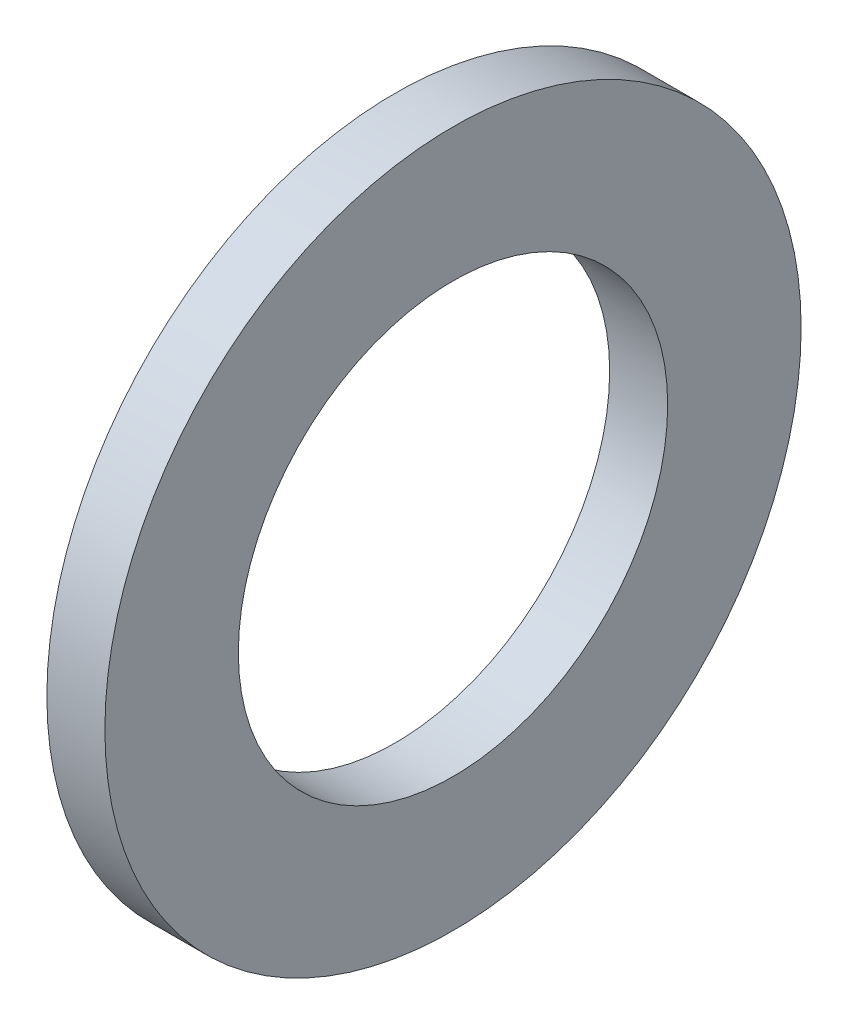
ISO-10303-21;
HEADER;
FILE_DESCRIPTION(('STEP AP214'),'2;1');
FILE_NAME('part.step','',(''),(''),'','','');
FILE_SCHEMA(('AUTOMOTIVE_DESIGN { 1 0 10303 214 1 1 1 1 }'));
ENDSEC;
DATA;
#1=APPLICATION_CONTEXT('core data for automotive mechanical design processes');
#2=APPLICATION_PROTOCOL_DEFINITION('international standard','automotive_design',2000,#1);
#3=PRODUCT_CONTEXT('',#1,'mechanical');
#4=PRODUCT('Part','Part','',(#3));
#5=PRODUCT_RELATED_PRODUCT_CATEGORY('part','',(#4));
#6=PRODUCT_DEFINITION_FORMATION('','',#4);
#7=PRODUCT_DEFINITION_CONTEXT('part definition',#1,'design');
#8=PRODUCT_DEFINITION('design','',#6,#7);
#9=PRODUCT_DEFINITION_SHAPE('','',#8);
#10=(LENGTH_UNIT() NAMED_UNIT(*) SI_UNIT(.MILLI.,.METRE.));
#11=(NAMED_UNIT(*) PLANE_ANGLE_UNIT() SI_UNIT($,.RADIAN.));
#12=(NAMED_UNIT(*) SI_UNIT($,.STERADIAN.) SOLID_ANGLE_UNIT());
#13=UNCERTAINTY_MEASURE_WITH_UNIT(LENGTH_MEASURE(1.E-05),#10,'distance_accuracy_value','');
#14=(GEOMETRIC_REPRESENTATION_CONTEXT(3) GLOBAL_UNCERTAINTY_ASSIGNED_CONTEXT((#13)) GLOBAL_UNIT_ASSIGNED_CONTEXT((#10,
#11,#12)) REPRESENTATION_CONTEXT('',''));
#15=CARTESIAN_POINT('',(0.,0.,0.));
#16=DIRECTION('',(0.,0.,1.));
#17=DIRECTION('',(1.,0.,0.));
#18=AXIS2_PLACEMENT_3D('',#15,#16,#17);
#19=CARTESIAN_POINT('',(-34.9249999999999,0.,0.));
#20=DIRECTION('',(-1.,0.,0.));
#21=DIRECTION('',(0.,0.,1.));
#22=AXIS2_PLACEMENT_3D('',#19,#20,#21);
#23=CYLINDRICAL_SURFACE('',#22,18.5);
#24=CARTESIAN_POINT('',(0.,0.,0.));
#25=DIRECTION('',(-1.,0.,0.));
#26=DIRECTION('',(0.,0.,1.));
#27=AXIS2_PLACEMENT_3D('',#24,#25,#26);
#28=CIRCLE('',#27,18.5);
#29=CARTESIAN_POINT('',(0.,0.,18.5));
#30=VERTEX_POINT('',#29);
#31=EDGE_CURVE('E10',#30,#30,#28,.T.);
#32=ORIENTED_EDGE('',*,*,#31,.F.);
#33=EDGE_LOOP('',(#32));
#34=FACE_BOUND('',#33,.T.);
#35=CARTESIAN_POINT('',(-5.,0.,0.));
#36=DIRECTION('',(-1.,0.,0.));
#37=DIRECTION('',(0.,0.,1.));
#38=AXIS2_PLACEMENT_3D('',#35,#36,#37);
#39=CIRCLE('',#38,18.5);
#40=CARTESIAN_POINT('',(-5.,0.,18.5));
#41=VERTEX_POINT('',#40);
#42=EDGE_CURVE('E44',#41,#41,#39,.T.);
#43=ORIENTED_EDGE('',*,*,#42,.T.);
#44=EDGE_LOOP('',(#43));
#45=FACE_BOUND('',#44,.T.);
#46=ADVANCED_FACE('F30',(#34,#45),#23,.F.);
#47=CARTESIAN_POINT('',(0.,18.5,0.));
#48=DIRECTION('',(-1.,0.,0.));
#49=DIRECTION('',(0.,0.,1.));
#50=AXIS2_PLACEMENT_3D('',#47,#48,#49);
#51=PLANE('',#50);
#52=CARTESIAN_POINT('',(0.,0.,0.));
#53=DIRECTION('',(-1.,0.,0.));
#54=DIRECTION('',(0.,0.,1.));
#55=AXIS2_PLACEMENT_3D('',#52,#53,#54);
#56=CIRCLE('',#55,30.);
#57=CARTESIAN_POINT('',(0.,0.,30.));
#58=VERTEX_POINT('',#57);
#59=EDGE_CURVE('E36',#58,#58,#56,.T.);
#60=ORIENTED_EDGE('',*,*,#59,.F.);
#61=EDGE_LOOP('',(#60));
#62=FACE_BOUND('',#61,.T.);
#63=ORIENTED_EDGE('',*,*,#31,.T.);
#64=EDGE_LOOP('',(#63));
#65=FACE_BOUND('',#64,.T.);
#66=ADVANCED_FACE('F59',(#62,#65),#51,.F.);
#67=CARTESIAN_POINT('',(-34.9249999999999,0.,0.));
#68=DIRECTION('',(-1.,0.,0.));
#69=DIRECTION('',(0.,0.,1.));
#70=AXIS2_PLACEMENT_3D('',#67,#68,#69);
#71=CYLINDRICAL_SURFACE('',#70,30.);
#72=CARTESIAN_POINT('',(-5.,0.,0.));
#73=DIRECTION('',(-1.,0.,0.));
#74=DIRECTION('',(0.,0.,1.));
#75=AXIS2_PLACEMENT_3D('',#72,#73,#74);
#76=CIRCLE('',#75,30.);
#77=CARTESIAN_POINT('',(-5.,0.,30.));
#78=VERTEX_POINT('',#77);
#79=EDGE_CURVE('E40',#78,#78,#76,.T.);
#80=ORIENTED_EDGE('',*,*,#79,.F.);
#81=EDGE_LOOP('',(#80));
#82=FACE_BOUND('',#81,.T.);
#83=ORIENTED_EDGE('',*,*,#59,.T.);
#84=EDGE_LOOP('',(#83));
#85=FACE_BOUND('',#84,.T.);
#86=ADVANCED_FACE('F54',(#82,#85),#71,.T.);
#87=CARTESIAN_POINT('',(-5.,30.,0.));
#88=DIRECTION('',(1.,0.,0.));
#89=DIRECTION('',(0.,0.,-1.));
#90=AXIS2_PLACEMENT_3D('',#87,#88,#89);
#91=PLANE('',#90);
#92=ORIENTED_EDGE('',*,*,#42,.F.);
#93=EDGE_LOOP('',(#92));
#94=FACE_BOUND('',#93,.T.);
#95=ORIENTED_EDGE('',*,*,#79,.T.);
#96=EDGE_LOOP('',(#95));
#97=FACE_BOUND('',#96,.T.);
#98=ADVANCED_FACE('F51',(#94,#97),#91,.F.);
#99=CLOSED_SHELL('',(#46,#66,#86,#98));
#100=MANIFOLD_SOLID_BREP('B2',#99);
#101=ADVANCED_BREP_SHAPE_REPRESENTATION('',(#18,#100),#14);
#102=SHAPE_DEFINITION_REPRESENTATION(#9,#101);
ENDSEC;
END-ISO-10303-21;
